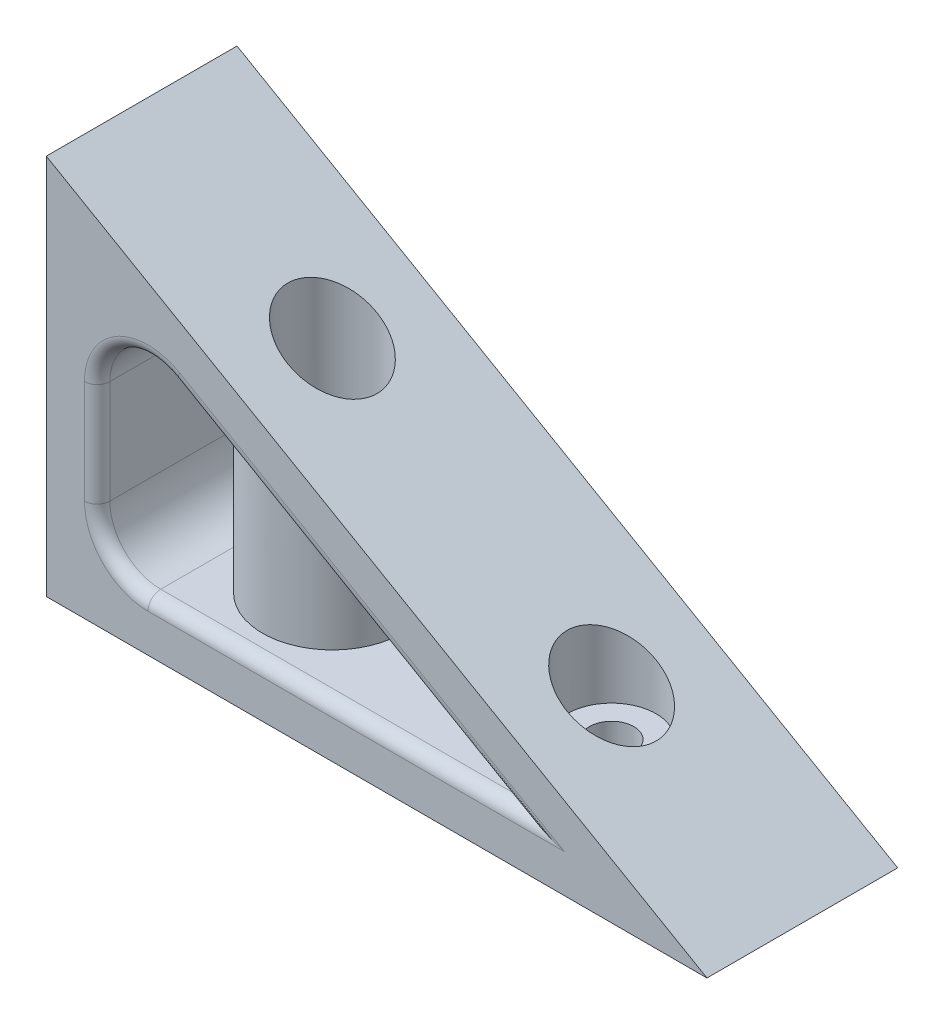
ISO-10303-21;
HEADER;
FILE_DESCRIPTION(('STEP AP214'),'2;1');
FILE_NAME('part.step','',(''),(''),'','','');
FILE_SCHEMA(('AUTOMOTIVE_DESIGN { 1 0 10303 214 1 1 1 1 }'));
ENDSEC;
DATA;
#1=APPLICATION_CONTEXT('core data for automotive mechanical design processes');
#2=APPLICATION_PROTOCOL_DEFINITION('international standard','automotive_design',2000,#1);
#3=PRODUCT_CONTEXT('',#1,'mechanical');
#4=PRODUCT('Part','Part','',(#3));
#5=PRODUCT_RELATED_PRODUCT_CATEGORY('part','',(#4));
#6=PRODUCT_DEFINITION_FORMATION('','',#4);
#7=PRODUCT_DEFINITION_CONTEXT('part definition',#1,'design');
#8=PRODUCT_DEFINITION('design','',#6,#7);
#9=PRODUCT_DEFINITION_SHAPE('','',#8);
#10=(LENGTH_UNIT() NAMED_UNIT(*) SI_UNIT(.MILLI.,.METRE.));
#11=(NAMED_UNIT(*) PLANE_ANGLE_UNIT() SI_UNIT($,.RADIAN.));
#12=(NAMED_UNIT(*) SI_UNIT($,.STERADIAN.) SOLID_ANGLE_UNIT());
#13=UNCERTAINTY_MEASURE_WITH_UNIT(LENGTH_MEASURE(1.E-05),#10,'distance_accuracy_value','');
#14=(GEOMETRIC_REPRESENTATION_CONTEXT(3) GLOBAL_UNCERTAINTY_ASSIGNED_CONTEXT((#13)) GLOBAL_UNIT_ASSIGNED_CONTEXT((#10,
#11,#12)) REPRESENTATION_CONTEXT('',''));
#15=CARTESIAN_POINT('',(0.,0.,0.));
#16=DIRECTION('',(0.,0.,1.));
#17=DIRECTION('',(1.,0.,0.));
#18=AXIS2_PLACEMENT_3D('',#15,#16,#17);
#19=CARTESIAN_POINT('',(36.9615242270665,5.,7.5));
#20=DIRECTION('',(0.,1.,0.));
#21=DIRECTION('',(0.,0.,1.));
#22=AXIS2_PLACEMENT_3D('',#19,#20,#21);
#23=CYLINDRICAL_SURFACE('',#22,3.5);
#24=CARTESIAN_POINT('',(36.9615242270665,5.,7.5));
#25=DIRECTION('',(0.,1.,0.));
#26=DIRECTION('',(0.,0.,1.));
#27=AXIS2_PLACEMENT_3D('',#24,#25,#26);
#28=CIRCLE('',#27,3.5);
#29=CARTESIAN_POINT('',(36.9615242270665,5.,11.));
#30=VERTEX_POINT('',#29);
#31=EDGE_CURVE('E238',#30,#30,#28,.T.);
#32=ORIENTED_EDGE('',*,*,#31,.F.);
#33=EDGE_LOOP('',(#32));
#34=FACE_BOUND('',#33,.T.);
#35=CARTESIAN_POINT('',(36.9615242270665,8.66025403784426,7.5));
#36=DIRECTION('',(0.499999999999995,0.866025403784441,0.));
#37=DIRECTION('',(-0.866025403784442,0.499999999999995,0.));
#38=AXIS2_PLACEMENT_3D('',#35,#36,#37);
#39=ELLIPSE('',#38,4.04145188432737,3.5);
#40=CARTESIAN_POINT('',(33.4615242270665,10.6809799800079,7.5));
#41=VERTEX_POINT('',#40);
#42=EDGE_CURVE('E233',#41,#41,#39,.F.);
#43=ORIENTED_EDGE('',*,*,#42,.F.);
#44=EDGE_LOOP('',(#43));
#45=FACE_BOUND('',#44,.T.);
#46=ADVANCED_FACE('F40',(#34,#45),#23,.F.);
#47=CARTESIAN_POINT('',(15.,5.,7.5));
#48=DIRECTION('',(0.,1.,0.));
#49=DIRECTION('',(0.,0.,1.));
#50=AXIS2_PLACEMENT_3D('',#47,#48,#49);
#51=CYLINDRICAL_SURFACE('',#50,3.5);
#52=CARTESIAN_POINT('',(15.,5.,7.5));
#53=DIRECTION('',(0.,1.,0.));
#54=DIRECTION('',(0.,0.,1.));
#55=AXIS2_PLACEMENT_3D('',#52,#53,#54);
#56=CIRCLE('',#55,3.5);
#57=CARTESIAN_POINT('',(15.,5.,11.));
#58=VERTEX_POINT('',#57);
#59=EDGE_CURVE('E224',#58,#58,#56,.T.);
#60=ORIENTED_EDGE('',*,*,#59,.F.);
#61=EDGE_LOOP('',(#60));
#62=FACE_BOUND('',#61,.T.);
#63=CARTESIAN_POINT('',(15.,21.3397459621554,7.5));
#64=DIRECTION('',(0.499999999999995,0.866025403784441,0.));
#65=DIRECTION('',(-0.866025403784442,0.499999999999995,0.));
#66=AXIS2_PLACEMENT_3D('',#63,#64,#65);
#67=ELLIPSE('',#66,4.04145188432737,3.5);
#68=CARTESIAN_POINT('',(11.5,23.3604719043191,7.5));
#69=VERTEX_POINT('',#68);
#70=EDGE_CURVE('E229',#69,#69,#67,.F.);
#71=ORIENTED_EDGE('',*,*,#70,.F.);
#72=EDGE_LOOP('',(#71));
#73=FACE_BOUND('',#72,.T.);
#74=ADVANCED_FACE('F318',(#62,#73),#51,.F.);
#75=CARTESIAN_POINT('',(15.,30.,7.5));
#76=DIRECTION('',(0.,-1.,0.));
#77=DIRECTION('',(0.,0.,-1.));
#78=AXIS2_PLACEMENT_3D('',#75,#76,#77);
#79=CYLINDRICAL_SURFACE('',#78,1.75);
#80=CARTESIAN_POINT('',(15.,0.,7.5));
#81=DIRECTION('',(0.,1.,0.));
#82=DIRECTION('',(0.,0.,1.));
#83=AXIS2_PLACEMENT_3D('',#80,#81,#82);
#84=CIRCLE('',#83,1.75);
#85=CARTESIAN_POINT('',(15.,0.,9.25));
#86=VERTEX_POINT('',#85);
#87=EDGE_CURVE('E228',#86,#86,#84,.T.);
#88=ORIENTED_EDGE('',*,*,#87,.F.);
#89=EDGE_LOOP('',(#88));
#90=FACE_BOUND('',#89,.T.);
#91=CARTESIAN_POINT('',(15.,5.,7.5));
#92=DIRECTION('',(0.,1.,0.));
#93=DIRECTION('',(0.,0.,1.));
#94=AXIS2_PLACEMENT_3D('',#91,#92,#93);
#95=CIRCLE('',#94,1.75);
#96=CARTESIAN_POINT('',(15.,5.,9.25));
#97=VERTEX_POINT('',#96);
#98=EDGE_CURVE('E223',#97,#97,#95,.F.);
#99=ORIENTED_EDGE('',*,*,#98,.F.);
#100=EDGE_LOOP('',(#99));
#101=FACE_BOUND('',#100,.T.);
#102=ADVANCED_FACE('F325',(#90,#101),#79,.F.);
#103=CARTESIAN_POINT('',(36.9615242270665,30.,7.5));
#104=DIRECTION('',(0.,-1.,0.));
#105=DIRECTION('',(0.,0.,-1.));
#106=AXIS2_PLACEMENT_3D('',#103,#104,#105);
#107=CYLINDRICAL_SURFACE('',#106,1.75);
#108=CARTESIAN_POINT('',(36.9615242270665,0.,7.5));
#109=DIRECTION('',(0.,1.,0.));
#110=DIRECTION('',(0.,0.,1.));
#111=AXIS2_PLACEMENT_3D('',#108,#109,#110);
#112=CIRCLE('',#111,1.75);
#113=CARTESIAN_POINT('',(36.9615242270665,0.,9.25));
#114=VERTEX_POINT('',#113);
#115=EDGE_CURVE('E171',#114,#114,#112,.T.);
#116=ORIENTED_EDGE('',*,*,#115,.F.);
#117=EDGE_LOOP('',(#116));
#118=FACE_BOUND('',#117,.T.);
#119=CARTESIAN_POINT('',(36.9615242270665,5.,7.5));
#120=DIRECTION('',(0.,1.,0.));
#121=DIRECTION('',(0.,0.,1.));
#122=AXIS2_PLACEMENT_3D('',#119,#120,#121);
#123=CIRCLE('',#122,1.75);
#124=CARTESIAN_POINT('',(36.9615242270665,5.,9.25));
#125=VERTEX_POINT('',#124);
#126=EDGE_CURVE('E219',#125,#125,#123,.F.);
#127=ORIENTED_EDGE('',*,*,#126,.F.);
#128=EDGE_LOOP('',(#127));
#129=FACE_BOUND('',#128,.T.);
#130=ADVANCED_FACE('F337',(#118,#129),#107,.F.);
#131=CARTESIAN_POINT('',(0.,29.9999999999997,15.));
#132=DIRECTION('',(1.,0.,0.));
#133=DIRECTION('',(0.,1.,0.));
#134=AXIS2_PLACEMENT_3D('',#131,#132,#133);
#135=PLANE('',#134);
#136=DIRECTION('',(0.,-1.,0.));
#137=VECTOR('',#136,1.);
#138=CARTESIAN_POINT('',(0.,29.9999999999997,0.));
#139=LINE('',#138,#137);
#140=CARTESIAN_POINT('',(0.,29.9999999999997,0.));
#141=VERTEX_POINT('',#140);
#142=CARTESIAN_POINT('',(0.,0.,0.));
#143=VERTEX_POINT('',#142);
#144=EDGE_CURVE('E182',#141,#143,#139,.T.);
#145=ORIENTED_EDGE('',*,*,#144,.T.);
#146=DIRECTION('',(0.,0.,-1.));
#147=VECTOR('',#146,1.);
#148=CARTESIAN_POINT('',(0.,0.,15.));
#149=LINE('',#148,#147);
#150=CARTESIAN_POINT('',(0.,0.,15.));
#151=VERTEX_POINT('',#150);
#152=EDGE_CURVE('E158',#151,#143,#149,.T.);
#153=ORIENTED_EDGE('',*,*,#152,.F.);
#154=DIRECTION('',(0.,-1.,0.));
#155=VECTOR('',#154,1.);
#156=CARTESIAN_POINT('',(0.,29.9999999999997,15.));
#157=LINE('',#156,#155);
#158=CARTESIAN_POINT('',(0.,29.9999999999997,15.));
#159=VERTEX_POINT('',#158);
#160=EDGE_CURVE('E186',#159,#151,#157,.T.);
#161=ORIENTED_EDGE('',*,*,#160,.F.);
#162=DIRECTION('',(0.,0.,-1.));
#163=VECTOR('',#162,1.);
#164=CARTESIAN_POINT('',(0.,29.9999999999997,15.));
#165=LINE('',#164,#163);
#166=EDGE_CURVE('E197',#159,#141,#165,.T.);
#167=ORIENTED_EDGE('',*,*,#166,.T.);
#168=EDGE_LOOP('',(#145,#153,#161,#167));
#169=FACE_BOUND('',#168,.T.);
#170=ADVANCED_FACE('F340',(#169),#135,.F.);
#171=CARTESIAN_POINT('',(0.,0.,15.));
#172=DIRECTION('',(0.,1.,0.));
#173=DIRECTION('',(0.,0.,1.));
#174=AXIS2_PLACEMENT_3D('',#171,#172,#173);
#175=PLANE('',#174);
#176=ORIENTED_EDGE('',*,*,#115,.T.);
#177=EDGE_LOOP('',(#176));
#178=FACE_BOUND('',#177,.T.);
#179=ORIENTED_EDGE('',*,*,#87,.T.);
#180=EDGE_LOOP('',(#179));
#181=FACE_BOUND('',#180,.T.);
#182=DIRECTION('',(1.,0.,0.));
#183=VECTOR('',#182,1.);
#184=CARTESIAN_POINT('',(0.,0.,0.));
#185=LINE('',#184,#183);
#186=CARTESIAN_POINT('',(51.9615242270665,0.,0.));
#187=VERTEX_POINT('',#186);
#188=EDGE_CURVE('E201',#143,#187,#185,.T.);
#189=ORIENTED_EDGE('',*,*,#188,.T.);
#190=DIRECTION('',(0.,0.,-1.));
#191=VECTOR('',#190,1.);
#192=CARTESIAN_POINT('',(51.9615242270665,0.,15.));
#193=LINE('',#192,#191);
#194=CARTESIAN_POINT('',(51.9615242270665,0.,15.));
#195=VERTEX_POINT('',#194);
#196=EDGE_CURVE('E209',#195,#187,#193,.T.);
#197=ORIENTED_EDGE('',*,*,#196,.F.);
#198=DIRECTION('',(1.,0.,0.));
#199=VECTOR('',#198,1.);
#200=CARTESIAN_POINT('',(0.,0.,15.));
#201=LINE('',#200,#199);
#202=EDGE_CURVE('E190',#151,#195,#201,.T.);
#203=ORIENTED_EDGE('',*,*,#202,.F.);
#204=ORIENTED_EDGE('',*,*,#152,.T.);
#205=EDGE_LOOP('',(#189,#197,#203,#204));
#206=FACE_BOUND('',#205,.T.);
#207=ADVANCED_FACE('F371',(#178,#181,#206),#175,.F.);
#208=CARTESIAN_POINT('',(51.9615242270665,0.,15.));
#209=DIRECTION('',(-0.499999999999995,-0.866025403784441,0.));
#210=DIRECTION('',(0.866025403784442,-0.499999999999995,0.));
#211=AXIS2_PLACEMENT_3D('',#208,#209,#210);
#212=PLANE('',#211);
#213=ORIENTED_EDGE('',*,*,#166,.F.);
#214=DIRECTION('',(-0.866025403784442,0.499999999999995,0.));
#215=VECTOR('',#214,1.);
#216=CARTESIAN_POINT('',(51.9615242270665,0.,15.));
#217=LINE('',#216,#215);
#218=EDGE_CURVE('E194',#195,#159,#217,.T.);
#219=ORIENTED_EDGE('',*,*,#218,.F.);
#220=ORIENTED_EDGE('',*,*,#196,.T.);
#221=DIRECTION('',(-0.866025403784442,0.499999999999995,0.));
#222=VECTOR('',#221,1.);
#223=CARTESIAN_POINT('',(51.9615242270665,0.,0.));
#224=LINE('',#223,#222);
#225=EDGE_CURVE('E191',#187,#141,#224,.T.);
#226=ORIENTED_EDGE('',*,*,#225,.T.);
#227=EDGE_LOOP('',(#213,#219,#220,#226));
#228=FACE_BOUND('',#227,.T.);
#229=ORIENTED_EDGE('',*,*,#70,.T.);
#230=EDGE_LOOP('',(#229));
#231=FACE_BOUND('',#230,.T.);
#232=ORIENTED_EDGE('',*,*,#42,.T.);
#233=EDGE_LOOP('',(#232));
#234=FACE_BOUND('',#233,.T.);
#235=ADVANCED_FACE('F374',(#228,#231,#234),#212,.F.);
#236=CARTESIAN_POINT('',(0.,0.,15.));
#237=DIRECTION('',(0.,0.,1.));
#238=DIRECTION('',(1.,0.,0.));
#239=AXIS2_PLACEMENT_3D('',#236,#237,#238);
#240=PLANE('',#239);
#241=CARTESIAN_POINT('',(8.,16.1435935394488,15.));
#242=DIRECTION('',(0.,0.,1.));
#243=DIRECTION('',(1.,0.,0.));
#244=AXIS2_PLACEMENT_3D('',#241,#242,#243);
#245=CIRCLE('',#244,5.);
#246=CARTESIAN_POINT('',(3.,16.1435935394488,15.));
#247=VERTEX_POINT('',#246);
#248=CARTESIAN_POINT('',(10.5,20.473720558371,15.));
#249=VERTEX_POINT('',#248);
#250=EDGE_CURVE('E58',#247,#249,#245,.F.);
#251=ORIENTED_EDGE('',*,*,#250,.T.);
#252=DIRECTION('',(-0.866025403784442,0.499999999999995,0.));
#253=VECTOR('',#252,1.);
#254=CARTESIAN_POINT('',(37.5333209967908,4.86602540378444,15.));
#255=LINE('',#254,#253);
#256=CARTESIAN_POINT('',(40.7653718043597,3.,15.));
#257=VERTEX_POINT('',#256);
#258=EDGE_CURVE('E656',#249,#257,#255,.F.);
#259=ORIENTED_EDGE('',*,*,#258,.T.);
#260=DIRECTION('',(1.,0.,0.));
#261=VECTOR('',#260,1.);
#262=CARTESIAN_POINT('',(8.,3.,15.));
#263=LINE('',#262,#261);
#264=CARTESIAN_POINT('',(8.,3.,15.));
#265=VERTEX_POINT('',#264);
#266=EDGE_CURVE('E639',#257,#265,#263,.F.);
#267=ORIENTED_EDGE('',*,*,#266,.T.);
#268=CARTESIAN_POINT('',(8.,8.,15.));
#269=DIRECTION('',(0.,0.,1.));
#270=DIRECTION('',(1.,0.,0.));
#271=AXIS2_PLACEMENT_3D('',#268,#269,#270);
#272=CIRCLE('',#271,5.);
#273=CARTESIAN_POINT('',(3.,8.,15.));
#274=VERTEX_POINT('',#273);
#275=EDGE_CURVE('E644',#265,#274,#272,.F.);
#276=ORIENTED_EDGE('',*,*,#275,.T.);
#277=DIRECTION('',(0.,-1.,0.));
#278=VECTOR('',#277,1.);
#279=CARTESIAN_POINT('',(3.,16.1435935394488,15.));
#280=LINE('',#279,#278);
#281=EDGE_CURVE('E63',#274,#247,#280,.F.);
#282=ORIENTED_EDGE('',*,*,#281,.T.);
#283=EDGE_LOOP('',(#251,#259,#267,#276,#282));
#284=FACE_BOUND('',#283,.T.);
#285=ORIENTED_EDGE('',*,*,#160,.T.);
#286=ORIENTED_EDGE('',*,*,#202,.T.);
#287=ORIENTED_EDGE('',*,*,#218,.T.);
#288=EDGE_LOOP('',(#285,#286,#287));
#289=FACE_BOUND('',#288,.T.);
#290=ADVANCED_FACE('F390',(#284,#289),#240,.T.);
#291=CARTESIAN_POINT('',(0.,0.,0.));
#292=DIRECTION('',(0.,0.,1.));
#293=DIRECTION('',(1.,0.,0.));
#294=AXIS2_PLACEMENT_3D('',#291,#292,#293);
#295=PLANE('',#294);
#296=DIRECTION('',(1.,0.,0.));
#297=VECTOR('',#296,1.);
#298=CARTESIAN_POINT('',(0.,3.,0.));
#299=LINE('',#298,#297);
#300=CARTESIAN_POINT('',(8.,3.,0.));
#301=VERTEX_POINT('',#300);
#302=CARTESIAN_POINT('',(40.7653718043597,3.,0.));
#303=VERTEX_POINT('',#302);
#304=EDGE_CURVE('E670',#301,#303,#299,.T.);
#305=ORIENTED_EDGE('',*,*,#304,.T.);
#306=DIRECTION('',(-0.866025403784442,0.499999999999995,0.));
#307=VECTOR('',#306,1.);
#308=CARTESIAN_POINT('',(11.4903810567664,19.9019237886466,0.));
#309=LINE('',#308,#307);
#310=CARTESIAN_POINT('',(10.5,20.473720558371,0.));
#311=VERTEX_POINT('',#310);
#312=EDGE_CURVE('E677',#303,#311,#309,.T.);
#313=ORIENTED_EDGE('',*,*,#312,.T.);
#314=CARTESIAN_POINT('',(8.,16.1435935394488,0.));
#315=DIRECTION('',(0.,0.,1.));
#316=DIRECTION('',(1.,0.,0.));
#317=AXIS2_PLACEMENT_3D('',#314,#315,#316);
#318=CIRCLE('',#317,5.);
#319=CARTESIAN_POINT('',(3.,16.1435935394488,0.));
#320=VERTEX_POINT('',#319);
#321=EDGE_CURVE('E606',#311,#320,#318,.T.);
#322=ORIENTED_EDGE('',*,*,#321,.T.);
#323=DIRECTION('',(0.,-1.,0.));
#324=VECTOR('',#323,1.);
#325=CARTESIAN_POINT('',(3.,0.,0.));
#326=LINE('',#325,#324);
#327=CARTESIAN_POINT('',(3.,8.,0.));
#328=VERTEX_POINT('',#327);
#329=EDGE_CURVE('E264',#320,#328,#326,.T.);
#330=ORIENTED_EDGE('',*,*,#329,.T.);
#331=CARTESIAN_POINT('',(8.,8.,0.));
#332=DIRECTION('',(0.,0.,1.));
#333=DIRECTION('',(1.,0.,0.));
#334=AXIS2_PLACEMENT_3D('',#331,#332,#333);
#335=CIRCLE('',#334,5.);
#336=EDGE_CURVE('E668',#328,#301,#335,.T.);
#337=ORIENTED_EDGE('',*,*,#336,.T.);
#338=EDGE_LOOP('',(#305,#313,#322,#330,#337));
#339=FACE_BOUND('',#338,.T.);
#340=ORIENTED_EDGE('',*,*,#144,.F.);
#341=ORIENTED_EDGE('',*,*,#225,.F.);
#342=ORIENTED_EDGE('',*,*,#188,.F.);
#343=EDGE_LOOP('',(#340,#341,#342));
#344=FACE_BOUND('',#343,.T.);
#345=ADVANCED_FACE('F386',(#339,#344),#295,.F.);
#346=CARTESIAN_POINT('',(37.0333209967908,4.,0.));
#347=DIRECTION('',(0.499999999999995,0.866025403784442,0.));
#348=DIRECTION('',(-0.866025403784442,0.499999999999995,0.));
#349=AXIS2_PLACEMENT_3D('',#346,#347,#348);
#350=PLANE('',#349);
#351=DIRECTION('',(0.,0.,1.));
#352=VECTOR('',#351,1.);
#353=CARTESIAN_POINT('',(9.99999999999998,19.6076951545865,0.));
#354=LINE('',#353,#352);
#355=CARTESIAN_POINT('',(9.99999999999998,19.6076951545865,5.20871215252212));
#356=VERTEX_POINT('',#355);
#357=CARTESIAN_POINT('',(9.99999999999998,19.6076951545865,1.));
#358=VERTEX_POINT('',#357);
#359=EDGE_CURVE('E249',#356,#358,#354,.F.);
#360=ORIENTED_EDGE('',*,*,#359,.T.);
#361=DIRECTION('',(-0.866025403784442,0.499999999999995,0.));
#362=VECTOR('',#361,1.);
#363=CARTESIAN_POINT('',(37.0333209967908,4.,1.));
#364=LINE('',#363,#362);
#365=CARTESIAN_POINT('',(37.0333209967908,4.,1.));
#366=VERTEX_POINT('',#365);
#367=EDGE_CURVE('E593',#358,#366,#364,.F.);
#368=ORIENTED_EDGE('',*,*,#367,.T.);
#369=DIRECTION('',(0.,0.,1.));
#370=VECTOR('',#369,1.);
#371=CARTESIAN_POINT('',(37.0333209967908,4.,0.));
#372=LINE('',#371,#370);
#373=CARTESIAN_POINT('',(37.0333209967908,4.,2.00046863597841));
#374=VERTEX_POINT('',#373);
#375=EDGE_CURVE('E168',#366,#374,#372,.T.);
#376=ORIENTED_EDGE('',*,*,#375,.T.);
#377=CARTESIAN_POINT('',(36.9615242270665,4.04145188432728,7.5));
#378=DIRECTION('',(0.499999999999995,0.866025403784442,0.));
#379=DIRECTION('',(0.866025403784442,-0.499999999999995,0.));
#380=AXIS2_PLACEMENT_3D('',#377,#378,#379);
#381=ELLIPSE('',#380,6.35085296108586,5.5);
#382=CARTESIAN_POINT('',(37.0333209967908,4.,12.9995313640216));
#383=VERTEX_POINT('',#382);
#384=EDGE_CURVE('E152',#374,#383,#381,.T.);
#385=ORIENTED_EDGE('',*,*,#384,.T.);
#386=CARTESIAN_POINT('',(37.0333209967908,4.,14.));
#387=VERTEX_POINT('',#386);
#388=EDGE_CURVE('E165',#383,#387,#372,.T.);
#389=ORIENTED_EDGE('',*,*,#388,.T.);
#390=DIRECTION('',(-0.866025403784442,0.499999999999995,0.));
#391=VECTOR('',#390,1.);
#392=CARTESIAN_POINT('',(9.99999999999998,19.6076951545865,14.));
#393=LINE('',#392,#391);
#394=CARTESIAN_POINT('',(9.99999999999998,19.6076951545865,14.));
#395=VERTEX_POINT('',#394);
#396=EDGE_CURVE('E603',#387,#395,#393,.T.);
#397=ORIENTED_EDGE('',*,*,#396,.T.);
#398=DIRECTION('',(0.,0.,1.));
#399=VECTOR('',#398,1.);
#400=CARTESIAN_POINT('',(9.99999999999998,19.6076951545865,0.));
#401=LINE('',#400,#399);
#402=CARTESIAN_POINT('',(9.99999999999998,19.6076951545865,9.79128784747788));
#403=VERTEX_POINT('',#402);
#404=EDGE_CURVE('E252',#395,#403,#401,.F.);
#405=ORIENTED_EDGE('',*,*,#404,.T.);
#406=CARTESIAN_POINT('',(15.,16.7209438086384,7.5));
#407=DIRECTION('',(0.499999999999995,0.866025403784442,0.));
#408=DIRECTION('',(0.866025403784442,-0.499999999999995,0.));
#409=AXIS2_PLACEMENT_3D('',#406,#407,#408);
#410=ELLIPSE('',#409,6.35085296108586,5.5);
#411=EDGE_CURVE('E178',#403,#356,#410,.T.);
#412=ORIENTED_EDGE('',*,*,#411,.T.);
#413=EDGE_LOOP('',(#360,#368,#376,#385,#389,#397,#405,#412));
#414=FACE_BOUND('',#413,.T.);
#415=ADVANCED_FACE('F163',(#414),#350,.F.);
#416=CARTESIAN_POINT('',(4.,4.,0.));
#417=DIRECTION('',(0.,-1.,0.));
#418=DIRECTION('',(0.,0.,-1.));
#419=AXIS2_PLACEMENT_3D('',#416,#417,#418);
#420=PLANE('',#419);
#421=CARTESIAN_POINT('',(15.,4.,7.5));
#422=DIRECTION('',(0.,-1.,0.));
#423=DIRECTION('',(0.,0.,-1.));
#424=AXIS2_PLACEMENT_3D('',#421,#422,#423);
#425=CIRCLE('',#424,5.5);
#426=CARTESIAN_POINT('',(15.,4.,2.));
#427=VERTEX_POINT('',#426);
#428=EDGE_CURVE('E170',#427,#427,#425,.T.);
#429=ORIENTED_EDGE('',*,*,#428,.T.);
#430=EDGE_LOOP('',(#429));
#431=FACE_BOUND('',#430,.T.);
#432=ORIENTED_EDGE('',*,*,#375,.F.);
#433=DIRECTION('',(1.,0.,0.));
#434=VECTOR('',#433,1.);
#435=CARTESIAN_POINT('',(4.,4.,1.));
#436=LINE('',#435,#434);
#437=CARTESIAN_POINT('',(8.,4.,1.));
#438=VERTEX_POINT('',#437);
#439=EDGE_CURVE('E688',#366,#438,#436,.F.);
#440=ORIENTED_EDGE('',*,*,#439,.T.);
#441=DIRECTION('',(0.,0.,1.));
#442=VECTOR('',#441,1.);
#443=CARTESIAN_POINT('',(8.,4.,15.));
#444=LINE('',#443,#442);
#445=CARTESIAN_POINT('',(8.,4.,14.));
#446=VERTEX_POINT('',#445);
#447=EDGE_CURVE('E157',#438,#446,#444,.T.);
#448=ORIENTED_EDGE('',*,*,#447,.T.);
#449=DIRECTION('',(1.,0.,0.));
#450=VECTOR('',#449,1.);
#451=CARTESIAN_POINT('',(37.0333209967908,4.,14.));
#452=LINE('',#451,#450);
#453=EDGE_CURVE('E176',#446,#387,#452,.T.);
#454=ORIENTED_EDGE('',*,*,#453,.T.);
#455=ORIENTED_EDGE('',*,*,#388,.F.);
#456=CARTESIAN_POINT('',(36.9615242270665,4.,7.5));
#457=DIRECTION('',(0.,-1.,0.));
#458=DIRECTION('',(0.,0.,-1.));
#459=AXIS2_PLACEMENT_3D('',#456,#457,#458);
#460=CIRCLE('',#459,5.5);
#461=EDGE_CURVE('E149',#383,#374,#460,.T.);
#462=ORIENTED_EDGE('',*,*,#461,.T.);
#463=EDGE_LOOP('',(#432,#440,#448,#454,#455,#462));
#464=FACE_BOUND('',#463,.T.);
#465=ADVANCED_FACE('F173',(#431,#464),#420,.F.);
#466=CARTESIAN_POINT('',(4.,23.0717967697242,0.));
#467=DIRECTION('',(-1.,0.,0.));
#468=DIRECTION('',(0.,0.,1.));
#469=AXIS2_PLACEMENT_3D('',#466,#467,#468);
#470=PLANE('',#469);
#471=DIRECTION('',(0.,0.,1.));
#472=VECTOR('',#471,1.);
#473=CARTESIAN_POINT('',(4.,16.1435935394488,15.));
#474=LINE('',#473,#472);
#475=CARTESIAN_POINT('',(4.,16.1435935394488,1.));
#476=VERTEX_POINT('',#475);
#477=CARTESIAN_POINT('',(4.,16.1435935394488,14.));
#478=VERTEX_POINT('',#477);
#479=EDGE_CURVE('E241',#476,#478,#474,.T.);
#480=ORIENTED_EDGE('',*,*,#479,.T.);
#481=DIRECTION('',(0.,-1.,0.));
#482=VECTOR('',#481,1.);
#483=CARTESIAN_POINT('',(4.,8.,14.));
#484=LINE('',#483,#482);
#485=CARTESIAN_POINT('',(4.,8.,14.));
#486=VERTEX_POINT('',#485);
#487=EDGE_CURVE('E12',#478,#486,#484,.T.);
#488=ORIENTED_EDGE('',*,*,#487,.T.);
#489=DIRECTION('',(0.,0.,1.));
#490=VECTOR('',#489,1.);
#491=CARTESIAN_POINT('',(4.,8.,0.));
#492=LINE('',#491,#490);
#493=CARTESIAN_POINT('',(4.,8.,1.));
#494=VERTEX_POINT('',#493);
#495=EDGE_CURVE('E245',#486,#494,#492,.F.);
#496=ORIENTED_EDGE('',*,*,#495,.T.);
#497=DIRECTION('',(0.,-1.,0.));
#498=VECTOR('',#497,1.);
#499=CARTESIAN_POINT('',(4.,23.0717967697242,1.));
#500=LINE('',#499,#498);
#501=EDGE_CURVE('E50',#494,#476,#500,.F.);
#502=ORIENTED_EDGE('',*,*,#501,.T.);
#503=EDGE_LOOP('',(#480,#488,#496,#502));
#504=FACE_BOUND('',#503,.T.);
#505=ADVANCED_FACE('F437',(#504),#470,.F.);
#506=CARTESIAN_POINT('',(15.,30.,7.5));
#507=DIRECTION('',(0.,-1.,0.));
#508=DIRECTION('',(0.,0.,-1.));
#509=AXIS2_PLACEMENT_3D('',#506,#507,#508);
#510=CYLINDRICAL_SURFACE('',#509,5.5);
#511=ORIENTED_EDGE('',*,*,#428,.F.);
#512=EDGE_LOOP('',(#511));
#513=FACE_BOUND('',#512,.T.);
#514=ORIENTED_EDGE('',*,*,#411,.F.);
#515=CARTESIAN_POINT('',(9.99999999999998,19.6076951545865,9.79128784747788));
#516=CARTESIAN_POINT('',(9.97237390302898,19.6236425651848,9.73100633280965));
#517=CARTESIAN_POINT('',(9.94574494112499,19.6385790756889,9.67001430513318));
#518=CARTESIAN_POINT('',(9.89458208958088,19.6665769612943,9.54674335421636));
#519=CARTESIAN_POINT('',(9.87004794531644,19.6796385644216,9.48446458852475));
#520=CARTESIAN_POINT('',(9.79976966411739,19.7162153047913,9.29598565370921));
#521=CARTESIAN_POINT('',(9.75730161777194,19.7371494084724,9.16803826417679));
#522=CARTESIAN_POINT('',(9.68176780188271,19.77311191422,8.9087693786057));
#523=CARTESIAN_POINT('',(9.6486921753083,19.7881465139953,8.77745157874842));
#524=CARTESIAN_POINT('',(9.59225286921287,19.813155359005,8.51225068689789));
#525=CARTESIAN_POINT('',(9.56889078328882,19.823128773964,8.37836717774214));
#526=CARTESIAN_POINT('',(9.53217035859263,19.838569800442,8.1092926786667));
#527=CARTESIAN_POINT('',(9.51878958847994,19.8440475180865,7.97410531631215));
#528=CARTESIAN_POINT('',(9.50207020827498,19.8508656686798,7.70300648944236));
#529=CARTESIAN_POINT('',(9.4987317321346,19.8522060464415,7.56709501529257));
#530=CARTESIAN_POINT('',(9.50212707228063,19.8508320582017,7.29545331869343));
#531=CARTESIAN_POINT('',(9.5088583469925,19.8481187153474,7.15972305915963));
#532=CARTESIAN_POINT('',(9.53232782089566,19.8384728458266,6.88927778565094));
#533=CARTESIAN_POINT('',(9.54906588930479,19.8315403743015,6.75456275843093));
#534=CARTESIAN_POINT('',(9.59062067840148,19.8137967651882,6.49794933834015));
#535=CARTESIAN_POINT('',(9.61466816405177,19.80334762223,6.37590090170342));
#536=CARTESIAN_POINT('',(9.6708454447795,19.7780426571096,6.13416308048171));
#537=CARTESIAN_POINT('',(9.70297356973289,19.7631877454276,6.01447321392788));
#538=CARTESIAN_POINT('',(9.77502970191701,19.7284072391764,5.7781002757861));
#539=CARTESIAN_POINT('',(9.81496385109541,19.7084776479788,5.66141965430248));
#540=CARTESIAN_POINT('',(9.902133482852,19.6627187002218,5.43193051891124));
#541=CARTESIAN_POINT('',(9.94937346734316,19.6368857012162,5.31912444526559));
#542=CARTESIAN_POINT('',(9.99999999999998,19.6076951545866,5.20871215252211));
#543=B_SPLINE_CURVE_WITH_KNOTS('',3,(#515,#516,#517,#518,#519,#520,#521,#522,#523,#524,#525,
#526,#527,#528,#529,#530,#531,#532,#533,#534,#535,#536,#537,#538,#539,#540,#541,#542),
.UNSPECIFIED.,.F.,.F.,(4,2,2,2,2,2,2,2,2,2,2,2,2,4),(0.,0.204562318170963,0.409099736363457,
0.817821167966093,1.22611206132295,1.63446991220533,2.04190725906539,2.44935004061613,
2.85669000219475,3.26402464022635,3.63817483221406,4.01224775748368,4.38661620479665,
4.76121626686618),.UNSPECIFIED.);
#544=EDGE_CURVE('E255',#403,#356,#543,.T.);
#545=ORIENTED_EDGE('',*,*,#544,.T.);
#546=EDGE_LOOP('',(#514,#545));
#547=FACE_BOUND('',#546,.T.);
#548=ADVANCED_FACE('F266',(#513,#547),#510,.T.);
#549=CARTESIAN_POINT('',(36.9615242270665,30.,7.5));
#550=DIRECTION('',(0.,-1.,0.));
#551=DIRECTION('',(0.,0.,-1.));
#552=AXIS2_PLACEMENT_3D('',#549,#550,#551);
#553=CYLINDRICAL_SURFACE('',#552,5.5);
#554=ORIENTED_EDGE('',*,*,#384,.F.);
#555=ORIENTED_EDGE('',*,*,#461,.F.);
#556=EDGE_LOOP('',(#554,#555));
#557=FACE_BOUND('',#556,.T.);
#558=ADVANCED_FACE('F151',(#557),#553,.T.);
#559=CARTESIAN_POINT('',(36.9615242270665,5.,7.5));
#560=DIRECTION('',(0.,1.,0.));
#561=DIRECTION('',(0.,0.,1.));
#562=AXIS2_PLACEMENT_3D('',#559,#560,#561);
#563=PLANE('',#562);
#564=ORIENTED_EDGE('',*,*,#31,.T.);
#565=EDGE_LOOP('',(#564));
#566=FACE_BOUND('',#565,.T.);
#567=ORIENTED_EDGE('',*,*,#126,.T.);
#568=EDGE_LOOP('',(#567));
#569=FACE_BOUND('',#568,.T.);
#570=ADVANCED_FACE('F332',(#566,#569),#563,.T.);
#571=CARTESIAN_POINT('',(15.,5.,7.5));
#572=DIRECTION('',(0.,1.,0.));
#573=DIRECTION('',(0.,0.,1.));
#574=AXIS2_PLACEMENT_3D('',#571,#572,#573);
#575=PLANE('',#574);
#576=ORIENTED_EDGE('',*,*,#59,.T.);
#577=EDGE_LOOP('',(#576));
#578=FACE_BOUND('',#577,.T.);
#579=ORIENTED_EDGE('',*,*,#98,.T.);
#580=EDGE_LOOP('',(#579));
#581=FACE_BOUND('',#580,.T.);
#582=ADVANCED_FACE('F335',(#578,#581),#575,.T.);
#583=CARTESIAN_POINT('',(8.,8.,0.));
#584=DIRECTION('',(0.,0.,-1.));
#585=DIRECTION('',(-1.,0.,0.));
#586=AXIS2_PLACEMENT_3D('',#583,#584,#585);
#587=CYLINDRICAL_SURFACE('',#586,4.);
#588=ORIENTED_EDGE('',*,*,#447,.F.);
#589=CARTESIAN_POINT('',(8.,8.,1.));
#590=DIRECTION('',(0.,0.,1.));
#591=DIRECTION('',(1.,0.,0.));
#592=AXIS2_PLACEMENT_3D('',#589,#590,#591);
#593=CIRCLE('',#592,4.);
#594=EDGE_CURVE('E650',#438,#494,#593,.F.);
#595=ORIENTED_EDGE('',*,*,#594,.T.);
#596=ORIENTED_EDGE('',*,*,#495,.F.);
#597=CARTESIAN_POINT('',(8.,8.,14.));
#598=DIRECTION('',(0.,0.,1.));
#599=DIRECTION('',(1.,0.,0.));
#600=AXIS2_PLACEMENT_3D('',#597,#598,#599);
#601=CIRCLE('',#600,4.);
#602=EDGE_CURVE('E643',#486,#446,#601,.T.);
#603=ORIENTED_EDGE('',*,*,#602,.T.);
#604=EDGE_LOOP('',(#588,#595,#596,#603));
#605=FACE_BOUND('',#604,.T.);
#606=ADVANCED_FACE('F276',(#605),#587,.F.);
#607=CARTESIAN_POINT('',(8.,16.1435935394488,0.));
#608=DIRECTION('',(0.,0.,-1.));
#609=DIRECTION('',(-1.,0.,0.));
#610=AXIS2_PLACEMENT_3D('',#607,#608,#609);
#611=CYLINDRICAL_SURFACE('',#610,4.);
#612=ORIENTED_EDGE('',*,*,#479,.F.);
#613=CARTESIAN_POINT('',(8.,16.1435935394488,1.));
#614=DIRECTION('',(0.,0.,1.));
#615=DIRECTION('',(1.,0.,0.));
#616=AXIS2_PLACEMENT_3D('',#613,#614,#615);
#617=CIRCLE('',#616,4.);
#618=EDGE_CURVE('E591',#476,#358,#617,.F.);
#619=ORIENTED_EDGE('',*,*,#618,.T.);
#620=ORIENTED_EDGE('',*,*,#359,.F.);
#621=ORIENTED_EDGE('',*,*,#544,.F.);
#622=ORIENTED_EDGE('',*,*,#404,.F.);
#623=CARTESIAN_POINT('',(8.,16.1435935394488,14.));
#624=DIRECTION('',(0.,0.,1.));
#625=DIRECTION('',(1.,0.,0.));
#626=AXIS2_PLACEMENT_3D('',#623,#624,#625);
#627=CIRCLE('',#626,4.);
#628=EDGE_CURVE('E602',#395,#478,#627,.T.);
#629=ORIENTED_EDGE('',*,*,#628,.T.);
#630=EDGE_LOOP('',(#612,#619,#620,#621,#622,#629));
#631=FACE_BOUND('',#630,.T.);
#632=ADVANCED_FACE('F270',(#631),#611,.F.);
#633=CARTESIAN_POINT('',(8.,8.,1.));
#634=DIRECTION('',(0.,0.,1.));
#635=DIRECTION('',(1.,0.,0.));
#636=AXIS2_PLACEMENT_3D('',#633,#634,#635);
#637=TOROIDAL_SURFACE('',#636,5.,1.);
#638=CARTESIAN_POINT('',(8.,3.,1.));
#639=DIRECTION('',(1.,0.,0.));
#640=DIRECTION('',(0.,0.,-1.));
#641=AXIS2_PLACEMENT_3D('',#638,#639,#640);
#642=CIRCLE('',#641,1.);
#643=EDGE_CURVE('E619',#301,#438,#642,.T.);
#644=ORIENTED_EDGE('',*,*,#643,.F.);
#645=ORIENTED_EDGE('',*,*,#336,.F.);
#646=CARTESIAN_POINT('',(3.,8.,1.));
#647=DIRECTION('',(0.,1.,0.));
#648=DIRECTION('',(0.,0.,1.));
#649=AXIS2_PLACEMENT_3D('',#646,#647,#648);
#650=CIRCLE('',#649,1.);
#651=EDGE_CURVE('E234',#494,#328,#650,.T.);
#652=ORIENTED_EDGE('',*,*,#651,.F.);
#653=ORIENTED_EDGE('',*,*,#594,.F.);
#654=EDGE_LOOP('',(#644,#645,#652,#653));
#655=FACE_BOUND('',#654,.T.);
#656=ADVANCED_FACE('F275',(#655),#637,.T.);
#657=CARTESIAN_POINT('',(3.,0.,1.));
#658=DIRECTION('',(0.,-1.,0.));
#659=DIRECTION('',(0.,0.,-1.));
#660=AXIS2_PLACEMENT_3D('',#657,#658,#659);
#661=CYLINDRICAL_SURFACE('',#660,1.);
#662=ORIENTED_EDGE('',*,*,#651,.T.);
#663=ORIENTED_EDGE('',*,*,#329,.F.);
#664=CARTESIAN_POINT('',(3.,16.1435935394488,1.));
#665=DIRECTION('',(0.,1.,0.));
#666=DIRECTION('',(0.,0.,1.));
#667=AXIS2_PLACEMENT_3D('',#664,#665,#666);
#668=CIRCLE('',#667,1.);
#669=EDGE_CURVE('E612',#476,#320,#668,.T.);
#670=ORIENTED_EDGE('',*,*,#669,.F.);
#671=ORIENTED_EDGE('',*,*,#501,.F.);
#672=EDGE_LOOP('',(#662,#663,#670,#671));
#673=FACE_BOUND('',#672,.T.);
#674=ADVANCED_FACE('F290',(#673),#661,.T.);
#675=CARTESIAN_POINT('',(0.,3.,1.));
#676=DIRECTION('',(1.,0.,0.));
#677=DIRECTION('',(0.,0.,-1.));
#678=AXIS2_PLACEMENT_3D('',#675,#676,#677);
#679=CYLINDRICAL_SURFACE('',#678,1.);
#680=ORIENTED_EDGE('',*,*,#643,.T.);
#681=ORIENTED_EDGE('',*,*,#439,.F.);
#682=CARTESIAN_POINT('',(40.7653718043597,3.,1.));
#683=DIRECTION('',(0.258819045102518,0.965925826289069,0.));
#684=DIRECTION('',(-0.965925826289069,0.258819045102518,0.));
#685=AXIS2_PLACEMENT_3D('',#682,#683,#684);
#686=ELLIPSE('',#685,3.86370330515632,1.);
#687=EDGE_CURVE('E599',#303,#366,#686,.T.);
#688=ORIENTED_EDGE('',*,*,#687,.F.);
#689=ORIENTED_EDGE('',*,*,#304,.F.);
#690=EDGE_LOOP('',(#680,#681,#688,#689));
#691=FACE_BOUND('',#690,.T.);
#692=ADVANCED_FACE('F286',(#691),#679,.T.);
#693=CARTESIAN_POINT('',(8.,16.1435935394488,1.));
#694=DIRECTION('',(0.,0.,1.));
#695=DIRECTION('',(1.,0.,0.));
#696=AXIS2_PLACEMENT_3D('',#693,#694,#695);
#697=TOROIDAL_SURFACE('',#696,5.,1.);
#698=ORIENTED_EDGE('',*,*,#669,.T.);
#699=ORIENTED_EDGE('',*,*,#321,.F.);
#700=CARTESIAN_POINT('',(10.5,20.473720558371,1.));
#701=DIRECTION('',(0.866025403784442,-0.499999999999995,0.));
#702=DIRECTION('',(0.499999999999995,0.866025403784442,0.));
#703=AXIS2_PLACEMENT_3D('',#700,#701,#702);
#704=CIRCLE('',#703,1.);
#705=EDGE_CURVE('E596',#358,#311,#704,.T.);
#706=ORIENTED_EDGE('',*,*,#705,.F.);
#707=ORIENTED_EDGE('',*,*,#618,.F.);
#708=EDGE_LOOP('',(#698,#699,#706,#707));
#709=FACE_BOUND('',#708,.T.);
#710=ADVANCED_FACE('F282',(#709),#697,.T.);
#711=CARTESIAN_POINT('',(11.4903810567664,19.9019237886466,1.));
#712=DIRECTION('',(-0.866025403784442,0.499999999999995,0.));
#713=DIRECTION('',(-0.499999999999995,-0.866025403784442,0.));
#714=AXIS2_PLACEMENT_3D('',#711,#712,#713);
#715=CYLINDRICAL_SURFACE('',#714,1.);
#716=ORIENTED_EDGE('',*,*,#687,.T.);
#717=ORIENTED_EDGE('',*,*,#367,.F.);
#718=ORIENTED_EDGE('',*,*,#705,.T.);
#719=ORIENTED_EDGE('',*,*,#312,.F.);
#720=EDGE_LOOP('',(#716,#717,#718,#719));
#721=FACE_BOUND('',#720,.T.);
#722=ADVANCED_FACE('F279',(#721),#715,.T.);
#723=CARTESIAN_POINT('',(8.,8.,14.));
#724=DIRECTION('',(0.,0.,1.));
#725=DIRECTION('',(1.,0.,0.));
#726=AXIS2_PLACEMENT_3D('',#723,#724,#725);
#727=TOROIDAL_SURFACE('',#726,5.,1.);
#728=CARTESIAN_POINT('',(8.,3.,14.));
#729=DIRECTION('',(1.,0.,0.));
#730=DIRECTION('',(0.,0.,-1.));
#731=AXIS2_PLACEMENT_3D('',#728,#729,#730);
#732=CIRCLE('',#731,1.);
#733=EDGE_CURVE('E614',#446,#265,#732,.T.);
#734=ORIENTED_EDGE('',*,*,#733,.F.);
#735=ORIENTED_EDGE('',*,*,#602,.F.);
#736=CARTESIAN_POINT('',(3.,8.,14.));
#737=DIRECTION('',(0.,1.,0.));
#738=DIRECTION('',(0.,0.,1.));
#739=AXIS2_PLACEMENT_3D('',#736,#737,#738);
#740=CIRCLE('',#739,1.);
#741=EDGE_CURVE('E44',#274,#486,#740,.T.);
#742=ORIENTED_EDGE('',*,*,#741,.F.);
#743=ORIENTED_EDGE('',*,*,#275,.F.);
#744=EDGE_LOOP('',(#734,#735,#742,#743));
#745=FACE_BOUND('',#744,.T.);
#746=ADVANCED_FACE('F42',(#745),#727,.T.);
#747=CARTESIAN_POINT('',(3.,23.0717967697242,14.));
#748=DIRECTION('',(0.,1.,0.));
#749=DIRECTION('',(0.,0.,1.));
#750=AXIS2_PLACEMENT_3D('',#747,#748,#749);
#751=CYLINDRICAL_SURFACE('',#750,1.);
#752=ORIENTED_EDGE('',*,*,#741,.T.);
#753=ORIENTED_EDGE('',*,*,#487,.F.);
#754=CARTESIAN_POINT('',(3.,16.1435935394488,14.));
#755=DIRECTION('',(0.,1.,0.));
#756=DIRECTION('',(0.,0.,1.));
#757=AXIS2_PLACEMENT_3D('',#754,#755,#756);
#758=CIRCLE('',#757,1.);
#759=EDGE_CURVE('E632',#247,#478,#758,.T.);
#760=ORIENTED_EDGE('',*,*,#759,.F.);
#761=ORIENTED_EDGE('',*,*,#281,.F.);
#762=EDGE_LOOP('',(#752,#753,#760,#761));
#763=FACE_BOUND('',#762,.T.);
#764=ADVANCED_FACE('F308',(#763),#751,.T.);
#765=CARTESIAN_POINT('',(4.,3.,14.));
#766=DIRECTION('',(-1.,0.,0.));
#767=DIRECTION('',(0.,0.,1.));
#768=AXIS2_PLACEMENT_3D('',#765,#766,#767);
#769=CYLINDRICAL_SURFACE('',#768,1.);
#770=ORIENTED_EDGE('',*,*,#733,.T.);
#771=ORIENTED_EDGE('',*,*,#266,.F.);
#772=CARTESIAN_POINT('',(40.7653718043597,3.,14.));
#773=DIRECTION('',(-0.258819045102518,-0.965925826289069,0.));
#774=DIRECTION('',(0.965925826289069,-0.258819045102518,0.));
#775=AXIS2_PLACEMENT_3D('',#772,#773,#774);
#776=ELLIPSE('',#775,3.86370330515632,1.);
#777=EDGE_CURVE('E629',#387,#257,#776,.F.);
#778=ORIENTED_EDGE('',*,*,#777,.F.);
#779=ORIENTED_EDGE('',*,*,#453,.F.);
#780=EDGE_LOOP('',(#770,#771,#778,#779));
#781=FACE_BOUND('',#780,.T.);
#782=ADVANCED_FACE('F305',(#781),#769,.T.);
#783=CARTESIAN_POINT('',(8.,16.1435935394488,14.));
#784=DIRECTION('',(0.,0.,1.));
#785=DIRECTION('',(1.,0.,0.));
#786=AXIS2_PLACEMENT_3D('',#783,#784,#785);
#787=TOROIDAL_SURFACE('',#786,5.,1.);
#788=ORIENTED_EDGE('',*,*,#759,.T.);
#789=ORIENTED_EDGE('',*,*,#628,.F.);
#790=CARTESIAN_POINT('',(10.5,20.473720558371,14.));
#791=DIRECTION('',(0.866025403784442,-0.499999999999995,0.));
#792=DIRECTION('',(0.499999999999995,0.866025403784442,0.));
#793=AXIS2_PLACEMENT_3D('',#790,#791,#792);
#794=CIRCLE('',#793,1.);
#795=EDGE_CURVE('E626',#249,#395,#794,.T.);
#796=ORIENTED_EDGE('',*,*,#795,.F.);
#797=ORIENTED_EDGE('',*,*,#250,.F.);
#798=EDGE_LOOP('',(#788,#789,#796,#797));
#799=FACE_BOUND('',#798,.T.);
#800=ADVANCED_FACE('F301',(#799),#787,.T.);
#801=CARTESIAN_POINT('',(37.5333209967908,4.86602540378444,14.));
#802=DIRECTION('',(0.866025403784442,-0.499999999999995,0.));
#803=DIRECTION('',(0.499999999999995,0.866025403784442,0.));
#804=AXIS2_PLACEMENT_3D('',#801,#802,#803);
#805=CYLINDRICAL_SURFACE('',#804,1.);
#806=ORIENTED_EDGE('',*,*,#777,.T.);
#807=ORIENTED_EDGE('',*,*,#258,.F.);
#808=ORIENTED_EDGE('',*,*,#795,.T.);
#809=ORIENTED_EDGE('',*,*,#396,.F.);
#810=EDGE_LOOP('',(#806,#807,#808,#809));
#811=FACE_BOUND('',#810,.T.);
#812=ADVANCED_FACE('F298',(#811),#805,.T.);
#813=CLOSED_SHELL('',(#46,#74,#102,#130,#170,#207,#235,#290,#345,#415,#465,#505,#548,#558,#570,
#582,#606,#632,#656,#674,#692,#710,#722,#746,#764,#782,#800,#812));
#814=MANIFOLD_SOLID_BREP('B2',#813);
#815=ADVANCED_BREP_SHAPE_REPRESENTATION('',(#18,#814),#14);
#816=SHAPE_DEFINITION_REPRESENTATION(#9,#815);
ENDSEC;
END-ISO-10303-21;
